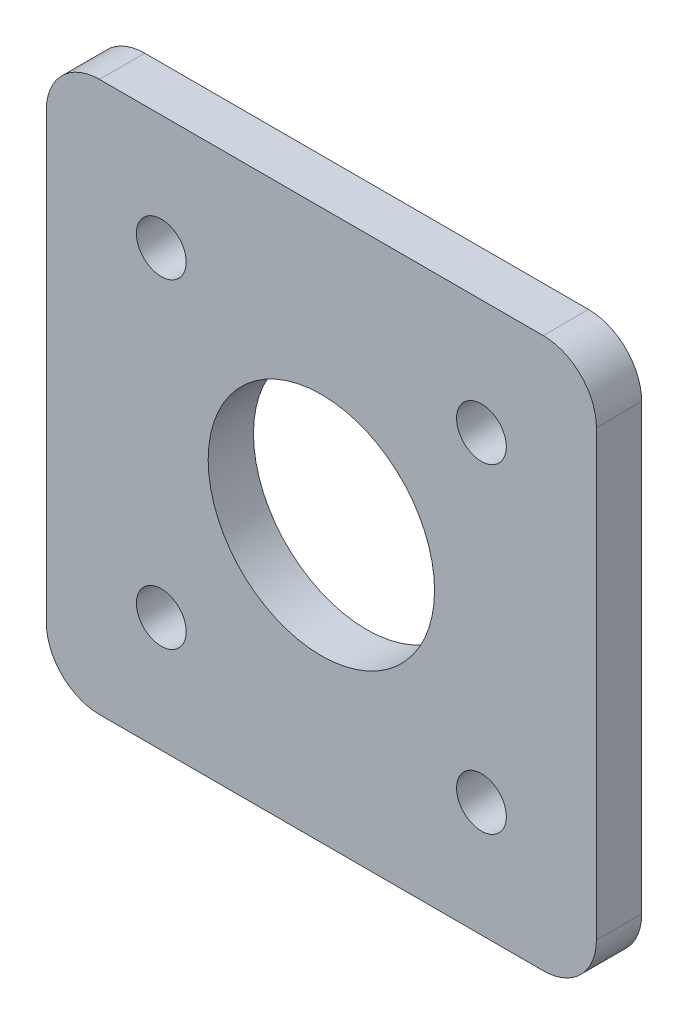
ISO-10303-21;
HEADER;
FILE_DESCRIPTION(('STEP AP214'),'2;1');
FILE_NAME('part.step','',(''),(''),'','','');
FILE_SCHEMA(('AUTOMOTIVE_DESIGN { 1 0 10303 214 1 1 1 1 }'));
ENDSEC;
DATA;
#1=APPLICATION_CONTEXT('core data for automotive mechanical design processes');
#2=APPLICATION_PROTOCOL_DEFINITION('international standard','automotive_design',2000,#1);
#3=PRODUCT_CONTEXT('',#1,'mechanical');
#4=PRODUCT('Part','Part','',(#3));
#5=PRODUCT_RELATED_PRODUCT_CATEGORY('part','',(#4));
#6=PRODUCT_DEFINITION_FORMATION('','',#4);
#7=PRODUCT_DEFINITION_CONTEXT('part definition',#1,'design');
#8=PRODUCT_DEFINITION('design','',#6,#7);
#9=PRODUCT_DEFINITION_SHAPE('','',#8);
#10=(LENGTH_UNIT() NAMED_UNIT(*) SI_UNIT(.MILLI.,.METRE.));
#11=(NAMED_UNIT(*) PLANE_ANGLE_UNIT() SI_UNIT($,.RADIAN.));
#12=(NAMED_UNIT(*) SI_UNIT($,.STERADIAN.) SOLID_ANGLE_UNIT());
#13=UNCERTAINTY_MEASURE_WITH_UNIT(LENGTH_MEASURE(1.E-05),#10,'distance_accuracy_value','');
#14=(GEOMETRIC_REPRESENTATION_CONTEXT(3) GLOBAL_UNCERTAINTY_ASSIGNED_CONTEXT((#13)) GLOBAL_UNIT_ASSIGNED_CONTEXT((#10,
#11,#12)) REPRESENTATION_CONTEXT('',''));
#15=CARTESIAN_POINT('',(0.,0.,0.));
#16=DIRECTION('',(0.,0.,1.));
#17=DIRECTION('',(1.,0.,0.));
#18=AXIS2_PLACEMENT_3D('',#15,#16,#17);
#19=CARTESIAN_POINT('',(-62.0404734314739,32.7318669160918,2.));
#20=DIRECTION('',(0.,0.,1.));
#21=DIRECTION('',(1.,0.,0.));
#22=AXIS2_PLACEMENT_3D('',#19,#20,#21);
#23=PLANE('',#22);
#24=CARTESIAN_POINT('',(-52.2404734314739,22.9318669160918,2.));
#25=DIRECTION('',(0.,0.,1.));
#26=DIRECTION('',(1.,0.,0.));
#27=AXIS2_PLACEMENT_3D('',#24,#25,#26);
#28=CIRCLE('',#27,5.);
#29=CARTESIAN_POINT('',(-47.2404734314739,22.9318669160918,2.));
#30=VERTEX_POINT('',#29);
#31=EDGE_CURVE('E212',#30,#30,#28,.T.);
#32=ORIENTED_EDGE('',*,*,#31,.F.);
#33=EDGE_LOOP('',(#32));
#34=FACE_BOUND('',#33,.T.);
#35=CARTESIAN_POINT('',(-59.3115412433393,30.0029347279573,2.));
#36=DIRECTION('',(0.,0.,1.));
#37=DIRECTION('',(1.,0.,0.));
#38=AXIS2_PLACEMENT_3D('',#35,#36,#37);
#39=CIRCLE('',#38,1.1);
#40=CARTESIAN_POINT('',(-58.2115412433393,30.0029347279573,2.));
#41=VERTEX_POINT('',#40);
#42=EDGE_CURVE('E167',#41,#41,#39,.T.);
#43=ORIENTED_EDGE('',*,*,#42,.F.);
#44=EDGE_LOOP('',(#43));
#45=FACE_BOUND('',#44,.T.);
#46=CARTESIAN_POINT('',(-45.1694056196085,15.8607991042263,2.));
#47=DIRECTION('',(0.,0.,1.));
#48=DIRECTION('',(1.,0.,0.));
#49=AXIS2_PLACEMENT_3D('',#46,#47,#48);
#50=CIRCLE('',#49,1.1);
#51=CARTESIAN_POINT('',(-44.0694056196085,15.8607991042263,2.));
#52=VERTEX_POINT('',#51);
#53=EDGE_CURVE('E179',#52,#52,#50,.T.);
#54=ORIENTED_EDGE('',*,*,#53,.F.);
#55=EDGE_LOOP('',(#54));
#56=FACE_BOUND('',#55,.T.);
#57=CARTESIAN_POINT('',(-45.1694056196084,30.0029347279573,2.));
#58=DIRECTION('',(0.,0.,1.));
#59=DIRECTION('',(1.,0.,0.));
#60=AXIS2_PLACEMENT_3D('',#57,#58,#59);
#61=CIRCLE('',#60,1.1);
#62=CARTESIAN_POINT('',(-44.0694056196084,30.0029347279573,2.));
#63=VERTEX_POINT('',#62);
#64=EDGE_CURVE('E11',#63,#63,#61,.T.);
#65=ORIENTED_EDGE('',*,*,#64,.F.);
#66=EDGE_LOOP('',(#65));
#67=FACE_BOUND('',#66,.T.);
#68=CARTESIAN_POINT('',(-59.3115412433394,15.8607991042264,2.));
#69=DIRECTION('',(0.,0.,1.));
#70=DIRECTION('',(1.,0.,0.));
#71=AXIS2_PLACEMENT_3D('',#68,#69,#70);
#72=CIRCLE('',#71,1.1);
#73=CARTESIAN_POINT('',(-58.2115412433394,15.8607991042264,2.));
#74=VERTEX_POINT('',#73);
#75=EDGE_CURVE('E173',#74,#74,#72,.T.);
#76=ORIENTED_EDGE('',*,*,#75,.F.);
#77=EDGE_LOOP('',(#76));
#78=FACE_BOUND('',#77,.T.);
#79=DIRECTION('',(-1.,0.,0.));
#80=VECTOR('',#79,1.);
#81=CARTESIAN_POINT('',(-42.4404734314739,35.0818669160918,2.));
#82=LINE('',#81,#80);
#83=CARTESIAN_POINT('',(-42.4404734314739,35.0818669160918,2.));
#84=VERTEX_POINT('',#83);
#85=CARTESIAN_POINT('',(-62.0404734314739,35.0818669160918,2.));
#86=VERTEX_POINT('',#85);
#87=EDGE_CURVE('E152',#84,#86,#82,.T.);
#88=ORIENTED_EDGE('',*,*,#87,.T.);
#89=CARTESIAN_POINT('',(-62.0404734314739,32.7318669160918,2.));
#90=DIRECTION('',(0.,0.,1.));
#91=DIRECTION('',(1.,0.,0.));
#92=AXIS2_PLACEMENT_3D('',#89,#90,#91);
#93=CIRCLE('',#92,2.35);
#94=CARTESIAN_POINT('',(-64.3904734314739,32.7318669160918,2.));
#95=VERTEX_POINT('',#94);
#96=EDGE_CURVE('E134',#86,#95,#93,.T.);
#97=ORIENTED_EDGE('',*,*,#96,.T.);
#98=DIRECTION('',(0.,-1.,0.));
#99=VECTOR('',#98,1.);
#100=CARTESIAN_POINT('',(-64.3904734314739,32.7318669160918,2.));
#101=LINE('',#100,#99);
#102=CARTESIAN_POINT('',(-64.3904734314739,13.1318669160918,2.));
#103=VERTEX_POINT('',#102);
#104=EDGE_CURVE('E137',#95,#103,#101,.T.);
#105=ORIENTED_EDGE('',*,*,#104,.T.);
#106=CARTESIAN_POINT('',(-62.0404734314739,13.1318669160918,2.));
#107=DIRECTION('',(0.,0.,1.));
#108=DIRECTION('',(1.,0.,0.));
#109=AXIS2_PLACEMENT_3D('',#106,#107,#108);
#110=CIRCLE('',#109,2.35000000000001);
#111=CARTESIAN_POINT('',(-62.0404734314739,10.7818669160918,2.));
#112=VERTEX_POINT('',#111);
#113=EDGE_CURVE('E48',#103,#112,#110,.T.);
#114=ORIENTED_EDGE('',*,*,#113,.T.);
#115=DIRECTION('',(1.,0.,0.));
#116=VECTOR('',#115,1.);
#117=CARTESIAN_POINT('',(-62.0404734314739,10.7818669160918,2.));
#118=LINE('',#117,#116);
#119=CARTESIAN_POINT('',(-42.4404734314739,10.7818669160918,2.));
#120=VERTEX_POINT('',#119);
#121=EDGE_CURVE('E105',#112,#120,#118,.T.);
#122=ORIENTED_EDGE('',*,*,#121,.T.);
#123=CARTESIAN_POINT('',(-42.4404734314739,13.1318669160918,2.));
#124=DIRECTION('',(0.,0.,1.));
#125=DIRECTION('',(1.,0.,0.));
#126=AXIS2_PLACEMENT_3D('',#123,#124,#125);
#127=CIRCLE('',#126,2.35);
#128=CARTESIAN_POINT('',(-40.0904734314739,13.1318669160918,2.));
#129=VERTEX_POINT('',#128);
#130=EDGE_CURVE('E143',#120,#129,#127,.T.);
#131=ORIENTED_EDGE('',*,*,#130,.T.);
#132=DIRECTION('',(0.,1.,0.));
#133=VECTOR('',#132,1.);
#134=CARTESIAN_POINT('',(-40.0904734314739,13.1318669160918,2.));
#135=LINE('',#134,#133);
#136=CARTESIAN_POINT('',(-40.0904734314739,32.7318669160918,2.));
#137=VERTEX_POINT('',#136);
#138=EDGE_CURVE('E146',#129,#137,#135,.T.);
#139=ORIENTED_EDGE('',*,*,#138,.T.);
#140=CARTESIAN_POINT('',(-42.4404734314739,32.7318669160918,2.));
#141=DIRECTION('',(0.,0.,1.));
#142=DIRECTION('',(1.,0.,0.));
#143=AXIS2_PLACEMENT_3D('',#140,#141,#142);
#144=CIRCLE('',#143,2.35);
#145=EDGE_CURVE('E149',#137,#84,#144,.T.);
#146=ORIENTED_EDGE('',*,*,#145,.T.);
#147=EDGE_LOOP('',(#88,#97,#105,#114,#122,#131,#139,#146));
#148=FACE_BOUND('',#147,.T.);
#149=ADVANCED_FACE('F33',(#34,#45,#56,#67,#78,#148),#23,.T.);
#150=CARTESIAN_POINT('',(-62.0404734314739,32.7318669160918,0.));
#151=DIRECTION('',(0.,0.,1.));
#152=DIRECTION('',(1.,0.,0.));
#153=AXIS2_PLACEMENT_3D('',#150,#151,#152);
#154=PLANE('',#153);
#155=CARTESIAN_POINT('',(-52.2404734314739,22.9318669160918,0.));
#156=DIRECTION('',(0.,0.,1.));
#157=DIRECTION('',(1.,0.,0.));
#158=AXIS2_PLACEMENT_3D('',#155,#156,#157);
#159=CIRCLE('',#158,5.);
#160=CARTESIAN_POINT('',(-47.2404734314739,22.9318669160918,0.));
#161=VERTEX_POINT('',#160);
#162=EDGE_CURVE('E138',#161,#161,#159,.T.);
#163=ORIENTED_EDGE('',*,*,#162,.T.);
#164=EDGE_LOOP('',(#163));
#165=FACE_BOUND('',#164,.T.);
#166=CARTESIAN_POINT('',(-59.3115412433393,30.0029347279573,0.));
#167=DIRECTION('',(0.,0.,1.));
#168=DIRECTION('',(1.,0.,0.));
#169=AXIS2_PLACEMENT_3D('',#166,#167,#168);
#170=CIRCLE('',#169,1.1);
#171=CARTESIAN_POINT('',(-58.2115412433393,30.0029347279573,0.));
#172=VERTEX_POINT('',#171);
#173=EDGE_CURVE('E157',#172,#172,#170,.T.);
#174=ORIENTED_EDGE('',*,*,#173,.T.);
#175=EDGE_LOOP('',(#174));
#176=FACE_BOUND('',#175,.T.);
#177=CARTESIAN_POINT('',(-59.3115412433394,15.8607991042264,0.));
#178=DIRECTION('',(0.,0.,1.));
#179=DIRECTION('',(1.,0.,0.));
#180=AXIS2_PLACEMENT_3D('',#177,#178,#179);
#181=CIRCLE('',#180,1.1);
#182=CARTESIAN_POINT('',(-58.2115412433394,15.8607991042264,0.));
#183=VERTEX_POINT('',#182);
#184=EDGE_CURVE('E170',#183,#183,#181,.T.);
#185=ORIENTED_EDGE('',*,*,#184,.T.);
#186=EDGE_LOOP('',(#185));
#187=FACE_BOUND('',#186,.T.);
#188=CARTESIAN_POINT('',(-45.1694056196085,15.8607991042263,0.));
#189=DIRECTION('',(0.,0.,1.));
#190=DIRECTION('',(1.,0.,0.));
#191=AXIS2_PLACEMENT_3D('',#188,#189,#190);
#192=CIRCLE('',#191,1.1);
#193=CARTESIAN_POINT('',(-44.0694056196085,15.8607991042263,0.));
#194=VERTEX_POINT('',#193);
#195=EDGE_CURVE('E176',#194,#194,#192,.T.);
#196=ORIENTED_EDGE('',*,*,#195,.T.);
#197=EDGE_LOOP('',(#196));
#198=FACE_BOUND('',#197,.T.);
#199=CARTESIAN_POINT('',(-45.1694056196084,30.0029347279573,0.));
#200=DIRECTION('',(0.,0.,1.));
#201=DIRECTION('',(1.,0.,0.));
#202=AXIS2_PLACEMENT_3D('',#199,#200,#201);
#203=CIRCLE('',#202,1.1);
#204=CARTESIAN_POINT('',(-44.0694056196084,30.0029347279573,0.));
#205=VERTEX_POINT('',#204);
#206=EDGE_CURVE('E37',#205,#205,#203,.T.);
#207=ORIENTED_EDGE('',*,*,#206,.T.);
#208=EDGE_LOOP('',(#207));
#209=FACE_BOUND('',#208,.T.);
#210=CARTESIAN_POINT('',(-62.0404734314739,32.7318669160918,0.));
#211=DIRECTION('',(0.,0.,1.));
#212=DIRECTION('',(1.,0.,0.));
#213=AXIS2_PLACEMENT_3D('',#210,#211,#212);
#214=CIRCLE('',#213,2.35);
#215=CARTESIAN_POINT('',(-62.0404734314739,35.0818669160918,0.));
#216=VERTEX_POINT('',#215);
#217=CARTESIAN_POINT('',(-64.3904734314739,32.7318669160918,0.));
#218=VERTEX_POINT('',#217);
#219=EDGE_CURVE('E56',#216,#218,#214,.T.);
#220=ORIENTED_EDGE('',*,*,#219,.F.);
#221=DIRECTION('',(-1.,0.,0.));
#222=VECTOR('',#221,1.);
#223=CARTESIAN_POINT('',(-42.4404734314739,35.0818669160918,0.));
#224=LINE('',#223,#222);
#225=CARTESIAN_POINT('',(-42.4404734314739,35.0818669160918,0.));
#226=VERTEX_POINT('',#225);
#227=EDGE_CURVE('E130',#226,#216,#224,.T.);
#228=ORIENTED_EDGE('',*,*,#227,.F.);
#229=CARTESIAN_POINT('',(-42.4404734314739,32.7318669160918,0.));
#230=DIRECTION('',(0.,0.,1.));
#231=DIRECTION('',(1.,0.,0.));
#232=AXIS2_PLACEMENT_3D('',#229,#230,#231);
#233=CIRCLE('',#232,2.35);
#234=CARTESIAN_POINT('',(-40.0904734314739,32.7318669160918,0.));
#235=VERTEX_POINT('',#234);
#236=EDGE_CURVE('E127',#235,#226,#233,.T.);
#237=ORIENTED_EDGE('',*,*,#236,.F.);
#238=DIRECTION('',(0.,1.,0.));
#239=VECTOR('',#238,1.);
#240=CARTESIAN_POINT('',(-40.0904734314739,13.1318669160918,0.));
#241=LINE('',#240,#239);
#242=CARTESIAN_POINT('',(-40.0904734314739,13.1318669160918,0.));
#243=VERTEX_POINT('',#242);
#244=EDGE_CURVE('E121',#243,#235,#241,.T.);
#245=ORIENTED_EDGE('',*,*,#244,.F.);
#246=CARTESIAN_POINT('',(-42.4404734314739,13.1318669160918,0.));
#247=DIRECTION('',(0.,0.,1.));
#248=DIRECTION('',(1.,0.,0.));
#249=AXIS2_PLACEMENT_3D('',#246,#247,#248);
#250=CIRCLE('',#249,2.35);
#251=CARTESIAN_POINT('',(-42.4404734314739,10.7818669160918,0.));
#252=VERTEX_POINT('',#251);
#253=EDGE_CURVE('E119',#252,#243,#250,.T.);
#254=ORIENTED_EDGE('',*,*,#253,.F.);
#255=DIRECTION('',(1.,0.,0.));
#256=VECTOR('',#255,1.);
#257=CARTESIAN_POINT('',(-62.0404734314739,10.7818669160918,0.));
#258=LINE('',#257,#256);
#259=CARTESIAN_POINT('',(-62.0404734314739,10.7818669160918,0.));
#260=VERTEX_POINT('',#259);
#261=EDGE_CURVE('E102',#260,#252,#258,.T.);
#262=ORIENTED_EDGE('',*,*,#261,.F.);
#263=CARTESIAN_POINT('',(-62.0404734314739,13.1318669160918,0.));
#264=DIRECTION('',(0.,0.,1.));
#265=DIRECTION('',(1.,0.,0.));
#266=AXIS2_PLACEMENT_3D('',#263,#264,#265);
#267=CIRCLE('',#266,2.35000000000001);
#268=CARTESIAN_POINT('',(-64.3904734314739,13.1318669160918,0.));
#269=VERTEX_POINT('',#268);
#270=EDGE_CURVE('E110',#269,#260,#267,.T.);
#271=ORIENTED_EDGE('',*,*,#270,.F.);
#272=DIRECTION('',(0.,-1.,0.));
#273=VECTOR('',#272,1.);
#274=CARTESIAN_POINT('',(-64.3904734314739,32.7318669160918,0.));
#275=LINE('',#274,#273);
#276=EDGE_CURVE('E115',#218,#269,#275,.T.);
#277=ORIENTED_EDGE('',*,*,#276,.F.);
#278=EDGE_LOOP('',(#220,#228,#237,#245,#254,#262,#271,#277));
#279=FACE_BOUND('',#278,.T.);
#280=ADVANCED_FACE('F35',(#165,#176,#187,#198,#209,#279),#154,.F.);
#281=CARTESIAN_POINT('',(-45.1694056196084,30.0029347279573,2.));
#282=DIRECTION('',(0.,0.,-1.));
#283=DIRECTION('',(-1.,0.,0.));
#284=AXIS2_PLACEMENT_3D('',#281,#282,#283);
#285=CYLINDRICAL_SURFACE('',#284,1.1);
#286=ORIENTED_EDGE('',*,*,#64,.T.);
#287=EDGE_LOOP('',(#286));
#288=FACE_BOUND('',#287,.T.);
#289=ORIENTED_EDGE('',*,*,#206,.F.);
#290=EDGE_LOOP('',(#289));
#291=FACE_BOUND('',#290,.T.);
#292=ADVANCED_FACE('F190',(#288,#291),#285,.F.);
#293=CARTESIAN_POINT('',(-45.1694056196085,15.8607991042263,2.));
#294=DIRECTION('',(0.,0.,-1.));
#295=DIRECTION('',(-1.,0.,0.));
#296=AXIS2_PLACEMENT_3D('',#293,#294,#295);
#297=CYLINDRICAL_SURFACE('',#296,1.1);
#298=ORIENTED_EDGE('',*,*,#53,.T.);
#299=EDGE_LOOP('',(#298));
#300=FACE_BOUND('',#299,.T.);
#301=ORIENTED_EDGE('',*,*,#195,.F.);
#302=EDGE_LOOP('',(#301));
#303=FACE_BOUND('',#302,.T.);
#304=ADVANCED_FACE('F187',(#300,#303),#297,.F.);
#305=CARTESIAN_POINT('',(-59.3115412433394,15.8607991042264,2.));
#306=DIRECTION('',(0.,0.,-1.));
#307=DIRECTION('',(-1.,0.,0.));
#308=AXIS2_PLACEMENT_3D('',#305,#306,#307);
#309=CYLINDRICAL_SURFACE('',#308,1.1);
#310=ORIENTED_EDGE('',*,*,#75,.T.);
#311=EDGE_LOOP('',(#310));
#312=FACE_BOUND('',#311,.T.);
#313=ORIENTED_EDGE('',*,*,#184,.F.);
#314=EDGE_LOOP('',(#313));
#315=FACE_BOUND('',#314,.T.);
#316=ADVANCED_FACE('F189',(#312,#315),#309,.F.);
#317=CARTESIAN_POINT('',(-59.3115412433393,30.0029347279573,2.));
#318=DIRECTION('',(0.,0.,-1.));
#319=DIRECTION('',(-1.,0.,0.));
#320=AXIS2_PLACEMENT_3D('',#317,#318,#319);
#321=CYLINDRICAL_SURFACE('',#320,1.1);
#322=ORIENTED_EDGE('',*,*,#42,.T.);
#323=EDGE_LOOP('',(#322));
#324=FACE_BOUND('',#323,.T.);
#325=ORIENTED_EDGE('',*,*,#173,.F.);
#326=EDGE_LOOP('',(#325));
#327=FACE_BOUND('',#326,.T.);
#328=ADVANCED_FACE('F197',(#324,#327),#321,.F.);
#329=CARTESIAN_POINT('',(-62.0404734314739,32.7318669160918,0.));
#330=DIRECTION('',(0.,0.,1.));
#331=DIRECTION('',(1.,0.,0.));
#332=AXIS2_PLACEMENT_3D('',#329,#330,#331);
#333=CYLINDRICAL_SURFACE('',#332,2.35);
#334=ORIENTED_EDGE('',*,*,#96,.F.);
#335=DIRECTION('',(0.,0.,1.));
#336=VECTOR('',#335,1.);
#337=CARTESIAN_POINT('',(-62.0404734314739,35.0818669160918,0.));
#338=LINE('',#337,#336);
#339=EDGE_CURVE('E155',#216,#86,#338,.T.);
#340=ORIENTED_EDGE('',*,*,#339,.F.);
#341=ORIENTED_EDGE('',*,*,#219,.T.);
#342=DIRECTION('',(0.,0.,1.));
#343=VECTOR('',#342,1.);
#344=CARTESIAN_POINT('',(-64.3904734314739,32.7318669160918,0.));
#345=LINE('',#344,#343);
#346=EDGE_CURVE('E133',#218,#95,#345,.T.);
#347=ORIENTED_EDGE('',*,*,#346,.T.);
#348=EDGE_LOOP('',(#334,#340,#341,#347));
#349=FACE_BOUND('',#348,.T.);
#350=ADVANCED_FACE('F227',(#349),#333,.T.);
#351=CARTESIAN_POINT('',(-42.4404734314739,35.0818669160918,0.));
#352=DIRECTION('',(0.,1.,0.));
#353=DIRECTION('',(0.,0.,1.));
#354=AXIS2_PLACEMENT_3D('',#351,#352,#353);
#355=PLANE('',#354);
#356=ORIENTED_EDGE('',*,*,#87,.F.);
#357=DIRECTION('',(0.,0.,1.));
#358=VECTOR('',#357,1.);
#359=CARTESIAN_POINT('',(-42.4404734314739,35.0818669160918,0.));
#360=LINE('',#359,#358);
#361=EDGE_CURVE('E158',#226,#84,#360,.T.);
#362=ORIENTED_EDGE('',*,*,#361,.F.);
#363=ORIENTED_EDGE('',*,*,#227,.T.);
#364=ORIENTED_EDGE('',*,*,#339,.T.);
#365=EDGE_LOOP('',(#356,#362,#363,#364));
#366=FACE_BOUND('',#365,.T.);
#367=ADVANCED_FACE('F225',(#366),#355,.T.);
#368=CARTESIAN_POINT('',(-42.4404734314739,32.7318669160918,0.));
#369=DIRECTION('',(0.,0.,1.));
#370=DIRECTION('',(1.,0.,0.));
#371=AXIS2_PLACEMENT_3D('',#368,#369,#370);
#372=CYLINDRICAL_SURFACE('',#371,2.35);
#373=ORIENTED_EDGE('',*,*,#145,.F.);
#374=DIRECTION('',(0.,0.,1.));
#375=VECTOR('',#374,1.);
#376=CARTESIAN_POINT('',(-40.0904734314739,32.7318669160918,0.));
#377=LINE('',#376,#375);
#378=EDGE_CURVE('E160',#235,#137,#377,.T.);
#379=ORIENTED_EDGE('',*,*,#378,.F.);
#380=ORIENTED_EDGE('',*,*,#236,.T.);
#381=ORIENTED_EDGE('',*,*,#361,.T.);
#382=EDGE_LOOP('',(#373,#379,#380,#381));
#383=FACE_BOUND('',#382,.T.);
#384=ADVANCED_FACE('F239',(#383),#372,.T.);
#385=CARTESIAN_POINT('',(-40.0904734314739,13.1318669160918,0.));
#386=DIRECTION('',(1.,0.,0.));
#387=DIRECTION('',(0.,0.,-1.));
#388=AXIS2_PLACEMENT_3D('',#385,#386,#387);
#389=PLANE('',#388);
#390=ORIENTED_EDGE('',*,*,#138,.F.);
#391=DIRECTION('',(0.,0.,1.));
#392=VECTOR('',#391,1.);
#393=CARTESIAN_POINT('',(-40.0904734314739,13.1318669160918,0.));
#394=LINE('',#393,#392);
#395=EDGE_CURVE('E162',#243,#129,#394,.T.);
#396=ORIENTED_EDGE('',*,*,#395,.F.);
#397=ORIENTED_EDGE('',*,*,#244,.T.);
#398=ORIENTED_EDGE('',*,*,#378,.T.);
#399=EDGE_LOOP('',(#390,#396,#397,#398));
#400=FACE_BOUND('',#399,.T.);
#401=ADVANCED_FACE('F236',(#400),#389,.T.);
#402=CARTESIAN_POINT('',(-42.4404734314739,13.1318669160918,0.));
#403=DIRECTION('',(0.,0.,1.));
#404=DIRECTION('',(1.,0.,0.));
#405=AXIS2_PLACEMENT_3D('',#402,#403,#404);
#406=CYLINDRICAL_SURFACE('',#405,2.35);
#407=ORIENTED_EDGE('',*,*,#130,.F.);
#408=DIRECTION('',(0.,0.,1.));
#409=VECTOR('',#408,1.);
#410=CARTESIAN_POINT('',(-42.4404734314739,10.7818669160918,0.));
#411=LINE('',#410,#409);
#412=EDGE_CURVE('E106',#252,#120,#411,.T.);
#413=ORIENTED_EDGE('',*,*,#412,.F.);
#414=ORIENTED_EDGE('',*,*,#253,.T.);
#415=ORIENTED_EDGE('',*,*,#395,.T.);
#416=EDGE_LOOP('',(#407,#413,#414,#415));
#417=FACE_BOUND('',#416,.T.);
#418=ADVANCED_FACE('F234',(#417),#406,.T.);
#419=CARTESIAN_POINT('',(-62.0404734314739,10.7818669160918,0.));
#420=DIRECTION('',(0.,-1.,0.));
#421=DIRECTION('',(1.,0.,0.));
#422=AXIS2_PLACEMENT_3D('',#419,#420,#421);
#423=PLANE('',#422);
#424=ORIENTED_EDGE('',*,*,#121,.F.);
#425=DIRECTION('',(0.,0.,1.));
#426=VECTOR('',#425,1.);
#427=CARTESIAN_POINT('',(-62.0404734314739,10.7818669160918,0.));
#428=LINE('',#427,#426);
#429=EDGE_CURVE('E98',#260,#112,#428,.T.);
#430=ORIENTED_EDGE('',*,*,#429,.F.);
#431=ORIENTED_EDGE('',*,*,#261,.T.);
#432=ORIENTED_EDGE('',*,*,#412,.T.);
#433=EDGE_LOOP('',(#424,#430,#431,#432));
#434=FACE_BOUND('',#433,.T.);
#435=ADVANCED_FACE('F100',(#434),#423,.T.);
#436=CARTESIAN_POINT('',(-62.0404734314739,13.1318669160918,0.));
#437=DIRECTION('',(0.,0.,1.));
#438=DIRECTION('',(1.,0.,0.));
#439=AXIS2_PLACEMENT_3D('',#436,#437,#438);
#440=CYLINDRICAL_SURFACE('',#439,2.35000000000001);
#441=ORIENTED_EDGE('',*,*,#113,.F.);
#442=DIRECTION('',(0.,0.,1.));
#443=VECTOR('',#442,1.);
#444=CARTESIAN_POINT('',(-64.3904734314739,13.1318669160918,0.));
#445=LINE('',#444,#443);
#446=EDGE_CURVE('E107',#269,#103,#445,.T.);
#447=ORIENTED_EDGE('',*,*,#446,.F.);
#448=ORIENTED_EDGE('',*,*,#270,.T.);
#449=ORIENTED_EDGE('',*,*,#429,.T.);
#450=EDGE_LOOP('',(#441,#447,#448,#449));
#451=FACE_BOUND('',#450,.T.);
#452=ADVANCED_FACE('F111',(#451),#440,.T.);
#453=CARTESIAN_POINT('',(-64.3904734314739,32.7318669160918,0.));
#454=DIRECTION('',(-1.,0.,0.));
#455=DIRECTION('',(0.,0.,1.));
#456=AXIS2_PLACEMENT_3D('',#453,#454,#455);
#457=PLANE('',#456);
#458=ORIENTED_EDGE('',*,*,#104,.F.);
#459=ORIENTED_EDGE('',*,*,#346,.F.);
#460=ORIENTED_EDGE('',*,*,#276,.T.);
#461=ORIENTED_EDGE('',*,*,#446,.T.);
#462=EDGE_LOOP('',(#458,#459,#460,#461));
#463=FACE_BOUND('',#462,.T.);
#464=ADVANCED_FACE('F230',(#463),#457,.T.);
#465=CARTESIAN_POINT('',(-52.2404734314739,22.9318669160918,0.));
#466=DIRECTION('',(0.,0.,1.));
#467=DIRECTION('',(1.,0.,0.));
#468=AXIS2_PLACEMENT_3D('',#465,#466,#467);
#469=CYLINDRICAL_SURFACE('',#468,5.);
#470=ORIENTED_EDGE('',*,*,#162,.F.);
#471=EDGE_LOOP('',(#470));
#472=FACE_BOUND('',#471,.T.);
#473=ORIENTED_EDGE('',*,*,#31,.T.);
#474=EDGE_LOOP('',(#473));
#475=FACE_BOUND('',#474,.T.);
#476=ADVANCED_FACE('F247',(#472,#475),#469,.F.);
#477=CLOSED_SHELL('',(#149,#280,#292,#304,#316,#328,#350,#367,#384,#401,#418,#435,#452,#464,#476));
#478=MANIFOLD_SOLID_BREP('B2',#477);
#479=ADVANCED_BREP_SHAPE_REPRESENTATION('',(#18,#478),#14);
#480=SHAPE_DEFINITION_REPRESENTATION(#9,#479);
ENDSEC;
END-ISO-10303-21;
